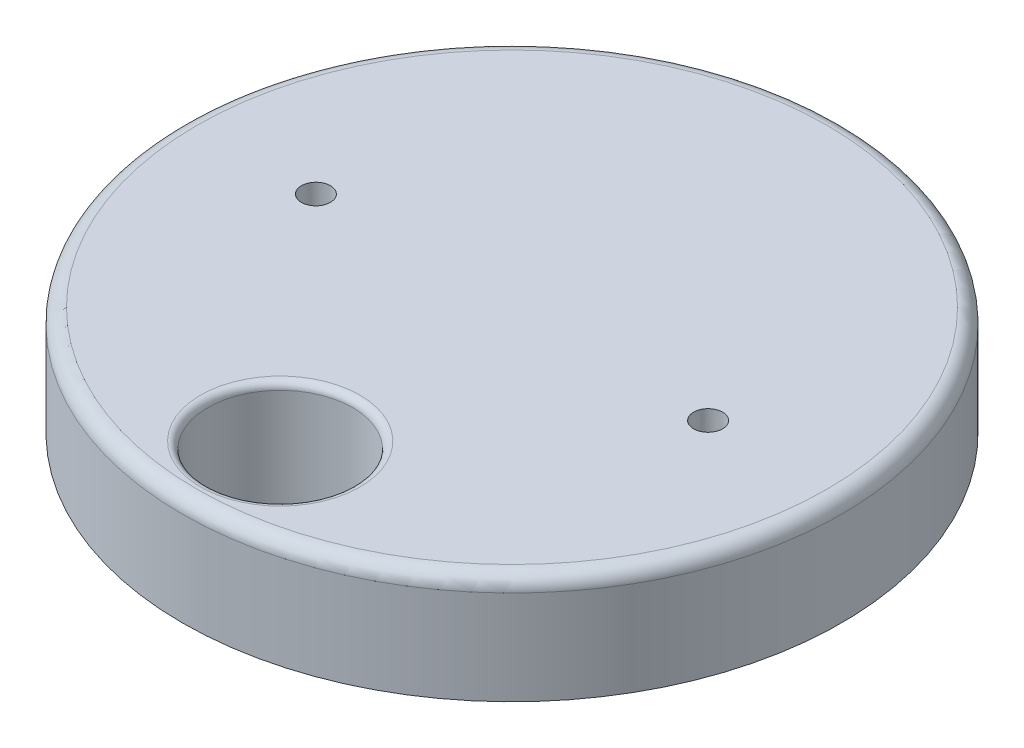
ISO-10303-21;
HEADER;
FILE_DESCRIPTION(('STEP AP214'),'2;1');
FILE_NAME('part.step','',(''),(''),'','','');
FILE_SCHEMA(('AUTOMOTIVE_DESIGN { 1 0 10303 214 1 1 1 1 }'));
ENDSEC;
DATA;
#1=APPLICATION_CONTEXT('core data for automotive mechanical design processes');
#2=APPLICATION_PROTOCOL_DEFINITION('international standard','automotive_design',2000,#1);
#3=PRODUCT_CONTEXT('',#1,'mechanical');
#4=PRODUCT('Part','Part','',(#3));
#5=PRODUCT_RELATED_PRODUCT_CATEGORY('part','',(#4));
#6=PRODUCT_DEFINITION_FORMATION('','',#4);
#7=PRODUCT_DEFINITION_CONTEXT('part definition',#1,'design');
#8=PRODUCT_DEFINITION('design','',#6,#7);
#9=PRODUCT_DEFINITION_SHAPE('','',#8);
#10=(LENGTH_UNIT() NAMED_UNIT(*) SI_UNIT(.MILLI.,.METRE.));
#11=(NAMED_UNIT(*) PLANE_ANGLE_UNIT() SI_UNIT($,.RADIAN.));
#12=(NAMED_UNIT(*) SI_UNIT($,.STERADIAN.) SOLID_ANGLE_UNIT());
#13=UNCERTAINTY_MEASURE_WITH_UNIT(LENGTH_MEASURE(1.E-05),#10,'distance_accuracy_value','');
#14=(GEOMETRIC_REPRESENTATION_CONTEXT(3) GLOBAL_UNCERTAINTY_ASSIGNED_CONTEXT((#13)) GLOBAL_UNIT_ASSIGNED_CONTEXT((#10,
#11,#12)) REPRESENTATION_CONTEXT('',''));
#15=CARTESIAN_POINT('',(0.,0.,0.));
#16=DIRECTION('',(0.,0.,1.));
#17=DIRECTION('',(1.,0.,0.));
#18=AXIS2_PLACEMENT_3D('',#15,#16,#17);
#19=CARTESIAN_POINT('',(27.0743127905892,-40.6568542494924,0.));
#20=DIRECTION('',(0.,1.,0.));
#21=DIRECTION('',(0.,0.,1.));
#22=AXIS2_PLACEMENT_3D('',#19,#20,#21);
#23=CYLINDRICAL_SURFACE('',#22,2.);
#24=CARTESIAN_POINT('',(27.0743127905892,-20.,0.));
#25=DIRECTION('',(0.,-1.,0.));
#26=DIRECTION('',(0.,0.,-1.));
#27=AXIS2_PLACEMENT_3D('',#24,#25,#26);
#28=CIRCLE('',#27,2.);
#29=CARTESIAN_POINT('',(27.0743127905892,-20.,-2.));
#30=VERTEX_POINT('',#29);
#31=EDGE_CURVE('E280',#30,#30,#28,.T.);
#32=ORIENTED_EDGE('',*,*,#31,.F.);
#33=EDGE_LOOP('',(#32));
#34=FACE_BOUND('',#33,.T.);
#35=CARTESIAN_POINT('',(27.0743127905892,-23.,0.));
#36=DIRECTION('',(0.,-1.,0.));
#37=DIRECTION('',(0.,0.,-1.));
#38=AXIS2_PLACEMENT_3D('',#35,#36,#37);
#39=CIRCLE('',#38,2.);
#40=CARTESIAN_POINT('',(27.0743127905892,-23.,-2.));
#41=VERTEX_POINT('',#40);
#42=EDGE_CURVE('E284',#41,#41,#39,.F.);
#43=ORIENTED_EDGE('',*,*,#42,.F.);
#44=EDGE_LOOP('',(#43));
#45=FACE_BOUND('',#44,.T.);
#46=ADVANCED_FACE('F44',(#34,#45),#23,.F.);
#47=CARTESIAN_POINT('',(-27.0743127905892,-40.6568542494924,0.));
#48=DIRECTION('',(0.,1.,0.));
#49=DIRECTION('',(0.,0.,1.));
#50=AXIS2_PLACEMENT_3D('',#47,#48,#49);
#51=CYLINDRICAL_SURFACE('',#50,2.);
#52=CARTESIAN_POINT('',(-27.0743127905892,-20.,0.));
#53=DIRECTION('',(0.,-1.,0.));
#54=DIRECTION('',(0.,0.,-1.));
#55=AXIS2_PLACEMENT_3D('',#52,#53,#54);
#56=CIRCLE('',#55,2.);
#57=CARTESIAN_POINT('',(-27.0743127905892,-20.,-2.));
#58=VERTEX_POINT('',#57);
#59=EDGE_CURVE('E279',#58,#58,#56,.T.);
#60=ORIENTED_EDGE('',*,*,#59,.F.);
#61=EDGE_LOOP('',(#60));
#62=FACE_BOUND('',#61,.T.);
#63=CARTESIAN_POINT('',(-27.0743127905892,-23.,0.));
#64=DIRECTION('',(0.,-1.,0.));
#65=DIRECTION('',(0.,0.,-1.));
#66=AXIS2_PLACEMENT_3D('',#63,#64,#65);
#67=CIRCLE('',#66,2.);
#68=CARTESIAN_POINT('',(-27.0743127905892,-23.,-2.));
#69=VERTEX_POINT('',#68);
#70=EDGE_CURVE('E198',#69,#69,#67,.F.);
#71=ORIENTED_EDGE('',*,*,#70,.F.);
#72=EDGE_LOOP('',(#71));
#73=FACE_BOUND('',#72,.T.);
#74=ADVANCED_FACE('F329',(#62,#73),#51,.F.);
#75=CARTESIAN_POINT('',(0.,-35.,0.));
#76=DIRECTION('',(0.,1.,0.));
#77=DIRECTION('',(0.,0.,1.));
#78=AXIS2_PLACEMENT_3D('',#75,#76,#77);
#79=CYLINDRICAL_SURFACE('',#78,45.5);
#80=CARTESIAN_POINT('',(0.,-22.,0.));
#81=DIRECTION('',(0.,-1.,0.));
#82=DIRECTION('',(0.,0.,-1.));
#83=AXIS2_PLACEMENT_3D('',#80,#81,#82);
#84=CIRCLE('',#83,45.5);
#85=CARTESIAN_POINT('',(0.,-22.,-45.5));
#86=VERTEX_POINT('',#85);
#87=EDGE_CURVE('E53',#86,#86,#84,.T.);
#88=ORIENTED_EDGE('',*,*,#87,.T.);
#89=EDGE_LOOP('',(#88));
#90=FACE_BOUND('',#89,.T.);
#91=CARTESIAN_POINT('',(0.,-35.,0.));
#92=DIRECTION('',(0.,-1.,0.));
#93=DIRECTION('',(0.,0.,-1.));
#94=AXIS2_PLACEMENT_3D('',#91,#92,#93);
#95=CIRCLE('',#94,45.5);
#96=CARTESIAN_POINT('',(0.,-35.,-45.5));
#97=VERTEX_POINT('',#96);
#98=EDGE_CURVE('E274',#97,#97,#95,.T.);
#99=ORIENTED_EDGE('',*,*,#98,.F.);
#100=EDGE_LOOP('',(#99));
#101=FACE_BOUND('',#100,.T.);
#102=ADVANCED_FACE('F304',(#90,#101),#79,.T.);
#103=CARTESIAN_POINT('',(0.,-35.,0.));
#104=DIRECTION('',(0.,-1.,0.));
#105=DIRECTION('',(0.,0.,-1.));
#106=AXIS2_PLACEMENT_3D('',#103,#104,#105);
#107=PLANE('',#106);
#108=CARTESIAN_POINT('',(0.,-35.,32.));
#109=DIRECTION('',(0.,-1.,0.));
#110=DIRECTION('',(0.,0.,-1.));
#111=AXIS2_PLACEMENT_3D('',#108,#109,#110);
#112=CIRCLE('',#111,10.);
#113=CARTESIAN_POINT('',(0.,-35.,22.));
#114=VERTEX_POINT('',#113);
#115=EDGE_CURVE('E166',#114,#114,#112,.F.);
#116=ORIENTED_EDGE('',*,*,#115,.T.);
#117=EDGE_LOOP('',(#116));
#118=FACE_BOUND('',#117,.T.);
#119=DIRECTION('',(-0.866025403784439,0.,0.5));
#120=VECTOR('',#119,1.);
#121=CARTESIAN_POINT('',(-24.0743127905892,-35.,1.73205080756888));
#122=LINE('',#121,#120);
#123=CARTESIAN_POINT('',(-24.0743127905892,-35.,1.73205080756888));
#124=VERTEX_POINT('',#123);
#125=CARTESIAN_POINT('',(-27.0743127905892,-35.,3.46410161513776));
#126=VERTEX_POINT('',#125);
#127=EDGE_CURVE('E60',#124,#126,#122,.T.);
#128=ORIENTED_EDGE('',*,*,#127,.F.);
#129=DIRECTION('',(0.,0.,1.));
#130=VECTOR('',#129,1.);
#131=CARTESIAN_POINT('',(-24.0743127905892,-35.,-1.73205080756888));
#132=LINE('',#131,#130);
#133=CARTESIAN_POINT('',(-24.0743127905892,-35.,-1.73205080756888));
#134=VERTEX_POINT('',#133);
#135=EDGE_CURVE('E159',#134,#124,#132,.T.);
#136=ORIENTED_EDGE('',*,*,#135,.F.);
#137=DIRECTION('',(0.866025403784439,0.,0.5));
#138=VECTOR('',#137,1.);
#139=CARTESIAN_POINT('',(-27.0743127905892,-35.,-3.46410161513776));
#140=LINE('',#139,#138);
#141=CARTESIAN_POINT('',(-27.0743127905892,-35.,-3.46410161513776));
#142=VERTEX_POINT('',#141);
#143=EDGE_CURVE('E163',#142,#134,#140,.T.);
#144=ORIENTED_EDGE('',*,*,#143,.F.);
#145=DIRECTION('',(0.866025403784439,0.,-0.5));
#146=VECTOR('',#145,1.);
#147=CARTESIAN_POINT('',(-30.0743127905892,-35.,-1.73205080756888));
#148=LINE('',#147,#146);
#149=CARTESIAN_POINT('',(-30.0743127905892,-35.,-1.73205080756888));
#150=VERTEX_POINT('',#149);
#151=EDGE_CURVE('E188',#150,#142,#148,.T.);
#152=ORIENTED_EDGE('',*,*,#151,.F.);
#153=DIRECTION('',(0.,0.,-1.));
#154=VECTOR('',#153,1.);
#155=CARTESIAN_POINT('',(-30.0743127905892,-35.,1.73205080756888));
#156=LINE('',#155,#154);
#157=CARTESIAN_POINT('',(-30.0743127905892,-35.,1.73205080756888));
#158=VERTEX_POINT('',#157);
#159=EDGE_CURVE('E184',#158,#150,#156,.T.);
#160=ORIENTED_EDGE('',*,*,#159,.F.);
#161=DIRECTION('',(-0.866025403784439,0.,-0.5));
#162=VECTOR('',#161,1.);
#163=CARTESIAN_POINT('',(-27.0743127905892,-35.,3.46410161513776));
#164=LINE('',#163,#162);
#165=EDGE_CURVE('E181',#126,#158,#164,.T.);
#166=ORIENTED_EDGE('',*,*,#165,.F.);
#167=EDGE_LOOP('',(#128,#136,#144,#152,#160,#166));
#168=FACE_BOUND('',#167,.T.);
#169=DIRECTION('',(-0.866025403784438,0.,0.5));
#170=VECTOR('',#169,1.);
#171=CARTESIAN_POINT('',(30.0743127905892,-35.,1.73205080756888));
#172=LINE('',#171,#170);
#173=CARTESIAN_POINT('',(30.0743127905892,-35.,1.73205080756888));
#174=VERTEX_POINT('',#173);
#175=CARTESIAN_POINT('',(27.0743127905892,-35.,3.46410161513775));
#176=VERTEX_POINT('',#175);
#177=EDGE_CURVE('E68',#174,#176,#172,.T.);
#178=ORIENTED_EDGE('',*,*,#177,.F.);
#179=DIRECTION('',(0.,0.,1.));
#180=VECTOR('',#179,1.);
#181=CARTESIAN_POINT('',(30.0743127905892,-35.,-1.73205080756888));
#182=LINE('',#181,#180);
#183=CARTESIAN_POINT('',(30.0743127905892,-35.,-1.73205080756888));
#184=VERTEX_POINT('',#183);
#185=EDGE_CURVE('E229',#184,#174,#182,.T.);
#186=ORIENTED_EDGE('',*,*,#185,.F.);
#187=DIRECTION('',(0.866025403784439,0.,0.5));
#188=VECTOR('',#187,1.);
#189=CARTESIAN_POINT('',(27.0743127905892,-35.,-3.46410161513775));
#190=LINE('',#189,#188);
#191=CARTESIAN_POINT('',(27.0743127905892,-35.,-3.46410161513775));
#192=VERTEX_POINT('',#191);
#193=EDGE_CURVE('E233',#192,#184,#190,.T.);
#194=ORIENTED_EDGE('',*,*,#193,.F.);
#195=DIRECTION('',(0.866025403784439,0.,-0.499999999999999));
#196=VECTOR('',#195,1.);
#197=CARTESIAN_POINT('',(24.0743127905892,-35.,-1.73205080756888));
#198=LINE('',#197,#196);
#199=CARTESIAN_POINT('',(24.0743127905892,-35.,-1.73205080756888));
#200=VERTEX_POINT('',#199);
#201=EDGE_CURVE('E238',#200,#192,#198,.T.);
#202=ORIENTED_EDGE('',*,*,#201,.F.);
#203=DIRECTION('',(0.,0.,-1.));
#204=VECTOR('',#203,1.);
#205=CARTESIAN_POINT('',(24.0743127905892,-35.,1.73205080756888));
#206=LINE('',#205,#204);
#207=CARTESIAN_POINT('',(24.0743127905892,-35.,1.73205080756888));
#208=VERTEX_POINT('',#207);
#209=EDGE_CURVE('E242',#208,#200,#206,.T.);
#210=ORIENTED_EDGE('',*,*,#209,.F.);
#211=DIRECTION('',(-0.866025403784439,0.,-0.5));
#212=VECTOR('',#211,1.);
#213=CARTESIAN_POINT('',(27.0743127905892,-35.,3.46410161513775));
#214=LINE('',#213,#212);
#215=EDGE_CURVE('E246',#176,#208,#214,.T.);
#216=ORIENTED_EDGE('',*,*,#215,.F.);
#217=EDGE_LOOP('',(#178,#186,#194,#202,#210,#216));
#218=FACE_BOUND('',#217,.T.);
#219=ORIENTED_EDGE('',*,*,#98,.T.);
#220=EDGE_LOOP('',(#219));
#221=FACE_BOUND('',#220,.T.);
#222=ADVANCED_FACE('F353',(#118,#168,#218,#221),#107,.T.);
#223=CARTESIAN_POINT('',(0.,-23.,0.));
#224=DIRECTION('',(0.,-1.,0.));
#225=DIRECTION('',(0.,0.,-1.));
#226=AXIS2_PLACEMENT_3D('',#223,#224,#225);
#227=PLANE('',#226);
#228=DIRECTION('',(-0.866025403784439,0.,0.5));
#229=VECTOR('',#228,1.);
#230=CARTESIAN_POINT('',(-24.0743127905892,-23.,1.73205080756888));
#231=LINE('',#230,#229);
#232=CARTESIAN_POINT('',(-24.0743127905892,-23.,1.73205080756888));
#233=VERTEX_POINT('',#232);
#234=CARTESIAN_POINT('',(-27.0743127905892,-23.,3.46410161513776));
#235=VERTEX_POINT('',#234);
#236=EDGE_CURVE('E136',#233,#235,#231,.T.);
#237=ORIENTED_EDGE('',*,*,#236,.T.);
#238=DIRECTION('',(-0.866025403784439,0.,-0.5));
#239=VECTOR('',#238,1.);
#240=CARTESIAN_POINT('',(-27.0743127905892,-23.,3.46410161513776));
#241=LINE('',#240,#239);
#242=CARTESIAN_POINT('',(-30.0743127905892,-23.,1.73205080756888));
#243=VERTEX_POINT('',#242);
#244=EDGE_CURVE('E146',#235,#243,#241,.T.);
#245=ORIENTED_EDGE('',*,*,#244,.T.);
#246=DIRECTION('',(0.,0.,-1.));
#247=VECTOR('',#246,1.);
#248=CARTESIAN_POINT('',(-30.0743127905892,-23.,1.73205080756888));
#249=LINE('',#248,#247);
#250=CARTESIAN_POINT('',(-30.0743127905892,-23.,-1.73205080756888));
#251=VERTEX_POINT('',#250);
#252=EDGE_CURVE('E152',#243,#251,#249,.T.);
#253=ORIENTED_EDGE('',*,*,#252,.T.);
#254=DIRECTION('',(0.866025403784439,0.,-0.5));
#255=VECTOR('',#254,1.);
#256=CARTESIAN_POINT('',(-30.0743127905892,-23.,-1.73205080756888));
#257=LINE('',#256,#255);
#258=CARTESIAN_POINT('',(-27.0743127905892,-23.,-3.46410161513776));
#259=VERTEX_POINT('',#258);
#260=EDGE_CURVE('E170',#251,#259,#257,.T.);
#261=ORIENTED_EDGE('',*,*,#260,.T.);
#262=DIRECTION('',(0.866025403784439,0.,0.5));
#263=VECTOR('',#262,1.);
#264=CARTESIAN_POINT('',(-27.0743127905892,-23.,-3.46410161513776));
#265=LINE('',#264,#263);
#266=CARTESIAN_POINT('',(-24.0743127905892,-23.,-1.73205080756888));
#267=VERTEX_POINT('',#266);
#268=EDGE_CURVE('E174',#259,#267,#265,.T.);
#269=ORIENTED_EDGE('',*,*,#268,.T.);
#270=DIRECTION('',(0.,0.,1.));
#271=VECTOR('',#270,1.);
#272=CARTESIAN_POINT('',(-24.0743127905892,-23.,-1.73205080756888));
#273=LINE('',#272,#271);
#274=EDGE_CURVE('E143',#267,#233,#273,.T.);
#275=ORIENTED_EDGE('',*,*,#274,.T.);
#276=EDGE_LOOP('',(#237,#245,#253,#261,#269,#275));
#277=FACE_BOUND('',#276,.T.);
#278=ORIENTED_EDGE('',*,*,#70,.T.);
#279=EDGE_LOOP('',(#278));
#280=FACE_BOUND('',#279,.T.);
#281=ADVANCED_FACE('F154',(#277,#280),#227,.T.);
#282=CARTESIAN_POINT('',(-24.0743127905892,-23.,1.73205080756888));
#283=DIRECTION('',(0.5,0.,0.866025403784439));
#284=DIRECTION('',(0.866025403784439,0.,-0.5));
#285=AXIS2_PLACEMENT_3D('',#282,#283,#284);
#286=PLANE('',#285);
#287=ORIENTED_EDGE('',*,*,#127,.T.);
#288=DIRECTION('',(0.,-1.,0.));
#289=VECTOR('',#288,1.);
#290=CARTESIAN_POINT('',(-27.0743127905892,-23.,3.46410161513776));
#291=LINE('',#290,#289);
#292=EDGE_CURVE('E132',#235,#126,#291,.T.);
#293=ORIENTED_EDGE('',*,*,#292,.F.);
#294=ORIENTED_EDGE('',*,*,#236,.F.);
#295=DIRECTION('',(0.,-1.,0.));
#296=VECTOR('',#295,1.);
#297=CARTESIAN_POINT('',(-24.0743127905892,-23.,1.73205080756888));
#298=LINE('',#297,#296);
#299=EDGE_CURVE('E195',#233,#124,#298,.T.);
#300=ORIENTED_EDGE('',*,*,#299,.T.);
#301=EDGE_LOOP('',(#287,#293,#294,#300));
#302=FACE_BOUND('',#301,.T.);
#303=ADVANCED_FACE('F134',(#302),#286,.F.);
#304=CARTESIAN_POINT('',(-24.0743127905892,-23.,-1.73205080756888));
#305=DIRECTION('',(1.,0.,0.));
#306=DIRECTION('',(0.,0.,-1.));
#307=AXIS2_PLACEMENT_3D('',#304,#305,#306);
#308=PLANE('',#307);
#309=ORIENTED_EDGE('',*,*,#135,.T.);
#310=ORIENTED_EDGE('',*,*,#299,.F.);
#311=ORIENTED_EDGE('',*,*,#274,.F.);
#312=DIRECTION('',(0.,-1.,0.));
#313=VECTOR('',#312,1.);
#314=CARTESIAN_POINT('',(-24.0743127905892,-23.,-1.73205080756888));
#315=LINE('',#314,#313);
#316=EDGE_CURVE('E199',#267,#134,#315,.T.);
#317=ORIENTED_EDGE('',*,*,#316,.T.);
#318=EDGE_LOOP('',(#309,#310,#311,#317));
#319=FACE_BOUND('',#318,.T.);
#320=ADVANCED_FACE('F385',(#319),#308,.F.);
#321=CARTESIAN_POINT('',(-27.0743127905892,-23.,-3.46410161513776));
#322=DIRECTION('',(0.5,0.,-0.866025403784439));
#323=DIRECTION('',(-0.866025403784439,0.,-0.5));
#324=AXIS2_PLACEMENT_3D('',#321,#322,#323);
#325=PLANE('',#324);
#326=ORIENTED_EDGE('',*,*,#143,.T.);
#327=ORIENTED_EDGE('',*,*,#316,.F.);
#328=ORIENTED_EDGE('',*,*,#268,.F.);
#329=DIRECTION('',(0.,-1.,0.));
#330=VECTOR('',#329,1.);
#331=CARTESIAN_POINT('',(-27.0743127905892,-23.,-3.46410161513776));
#332=LINE('',#331,#330);
#333=EDGE_CURVE('E202',#259,#142,#332,.T.);
#334=ORIENTED_EDGE('',*,*,#333,.T.);
#335=EDGE_LOOP('',(#326,#327,#328,#334));
#336=FACE_BOUND('',#335,.T.);
#337=ADVANCED_FACE('F393',(#336),#325,.F.);
#338=CARTESIAN_POINT('',(-30.0743127905892,-23.,-1.73205080756888));
#339=DIRECTION('',(-0.5,0.,-0.866025403784439));
#340=DIRECTION('',(-0.866025403784439,0.,0.5));
#341=AXIS2_PLACEMENT_3D('',#338,#339,#340);
#342=PLANE('',#341);
#343=ORIENTED_EDGE('',*,*,#151,.T.);
#344=ORIENTED_EDGE('',*,*,#333,.F.);
#345=ORIENTED_EDGE('',*,*,#260,.F.);
#346=DIRECTION('',(0.,-1.,0.));
#347=VECTOR('',#346,1.);
#348=CARTESIAN_POINT('',(-30.0743127905892,-23.,-1.73205080756888));
#349=LINE('',#348,#347);
#350=EDGE_CURVE('E205',#251,#150,#349,.T.);
#351=ORIENTED_EDGE('',*,*,#350,.T.);
#352=EDGE_LOOP('',(#343,#344,#345,#351));
#353=FACE_BOUND('',#352,.T.);
#354=ADVANCED_FACE('F402',(#353),#342,.F.);
#355=CARTESIAN_POINT('',(-30.0743127905892,-23.,1.73205080756888));
#356=DIRECTION('',(-1.,0.,0.));
#357=DIRECTION('',(0.,0.,1.));
#358=AXIS2_PLACEMENT_3D('',#355,#356,#357);
#359=PLANE('',#358);
#360=ORIENTED_EDGE('',*,*,#159,.T.);
#361=ORIENTED_EDGE('',*,*,#350,.F.);
#362=ORIENTED_EDGE('',*,*,#252,.F.);
#363=DIRECTION('',(0.,-1.,0.));
#364=VECTOR('',#363,1.);
#365=CARTESIAN_POINT('',(-30.0743127905892,-23.,1.73205080756888));
#366=LINE('',#365,#364);
#367=EDGE_CURVE('E142',#243,#158,#366,.T.);
#368=ORIENTED_EDGE('',*,*,#367,.T.);
#369=EDGE_LOOP('',(#360,#361,#362,#368));
#370=FACE_BOUND('',#369,.T.);
#371=ADVANCED_FACE('F345',(#370),#359,.F.);
#372=CARTESIAN_POINT('',(-27.0743127905892,-23.,3.46410161513776));
#373=DIRECTION('',(-0.5,0.,0.866025403784439));
#374=DIRECTION('',(0.866025403784439,0.,0.5));
#375=AXIS2_PLACEMENT_3D('',#372,#373,#374);
#376=PLANE('',#375);
#377=ORIENTED_EDGE('',*,*,#165,.T.);
#378=ORIENTED_EDGE('',*,*,#367,.F.);
#379=ORIENTED_EDGE('',*,*,#244,.F.);
#380=ORIENTED_EDGE('',*,*,#292,.T.);
#381=EDGE_LOOP('',(#377,#378,#379,#380));
#382=FACE_BOUND('',#381,.T.);
#383=ADVANCED_FACE('F147',(#382),#376,.F.);
#384=CARTESIAN_POINT('',(0.,-23.,0.));
#385=DIRECTION('',(0.,-1.,0.));
#386=DIRECTION('',(0.,0.,-1.));
#387=AXIS2_PLACEMENT_3D('',#384,#385,#386);
#388=PLANE('',#387);
#389=DIRECTION('',(-0.866025403784438,0.,0.5));
#390=VECTOR('',#389,1.);
#391=CARTESIAN_POINT('',(30.0743127905892,-23.,1.73205080756888));
#392=LINE('',#391,#390);
#393=CARTESIAN_POINT('',(30.0743127905892,-23.,1.73205080756888));
#394=VERTEX_POINT('',#393);
#395=CARTESIAN_POINT('',(27.0743127905892,-23.,3.46410161513775));
#396=VERTEX_POINT('',#395);
#397=EDGE_CURVE('E234',#394,#396,#392,.T.);
#398=ORIENTED_EDGE('',*,*,#397,.T.);
#399=DIRECTION('',(-0.866025403784439,0.,-0.5));
#400=VECTOR('',#399,1.);
#401=CARTESIAN_POINT('',(27.0743127905892,-23.,3.46410161513775));
#402=LINE('',#401,#400);
#403=CARTESIAN_POINT('',(24.0743127905892,-23.,1.73205080756888));
#404=VERTEX_POINT('',#403);
#405=EDGE_CURVE('E267',#396,#404,#402,.T.);
#406=ORIENTED_EDGE('',*,*,#405,.T.);
#407=DIRECTION('',(0.,0.,-1.));
#408=VECTOR('',#407,1.);
#409=CARTESIAN_POINT('',(24.0743127905892,-23.,1.73205080756888));
#410=LINE('',#409,#408);
#411=CARTESIAN_POINT('',(24.0743127905892,-23.,-1.73205080756888));
#412=VERTEX_POINT('',#411);
#413=EDGE_CURVE('E263',#404,#412,#410,.T.);
#414=ORIENTED_EDGE('',*,*,#413,.T.);
#415=DIRECTION('',(0.866025403784439,0.,-0.499999999999999));
#416=VECTOR('',#415,1.);
#417=CARTESIAN_POINT('',(24.0743127905892,-23.,-1.73205080756888));
#418=LINE('',#417,#416);
#419=CARTESIAN_POINT('',(27.0743127905892,-23.,-3.46410161513775));
#420=VERTEX_POINT('',#419);
#421=EDGE_CURVE('E259',#412,#420,#418,.T.);
#422=ORIENTED_EDGE('',*,*,#421,.T.);
#423=DIRECTION('',(0.866025403784439,0.,0.5));
#424=VECTOR('',#423,1.);
#425=CARTESIAN_POINT('',(27.0743127905892,-23.,-3.46410161513775));
#426=LINE('',#425,#424);
#427=CARTESIAN_POINT('',(30.0743127905892,-23.,-1.73205080756888));
#428=VERTEX_POINT('',#427);
#429=EDGE_CURVE('E255',#420,#428,#426,.T.);
#430=ORIENTED_EDGE('',*,*,#429,.T.);
#431=DIRECTION('',(0.,0.,1.));
#432=VECTOR('',#431,1.);
#433=CARTESIAN_POINT('',(30.0743127905892,-23.,-1.73205080756888));
#434=LINE('',#433,#432);
#435=EDGE_CURVE('E213',#428,#394,#434,.T.);
#436=ORIENTED_EDGE('',*,*,#435,.T.);
#437=EDGE_LOOP('',(#398,#406,#414,#422,#430,#436));
#438=FACE_BOUND('',#437,.T.);
#439=ORIENTED_EDGE('',*,*,#42,.T.);
#440=EDGE_LOOP('',(#439));
#441=FACE_BOUND('',#440,.T.);
#442=ADVANCED_FACE('F333',(#438,#441),#388,.T.);
#443=CARTESIAN_POINT('',(30.0743127905892,-23.,1.73205080756888));
#444=DIRECTION('',(0.5,0.,0.866025403784439));
#445=DIRECTION('',(0.866025403784439,0.,-0.5));
#446=AXIS2_PLACEMENT_3D('',#443,#444,#445);
#447=PLANE('',#446);
#448=ORIENTED_EDGE('',*,*,#177,.T.);
#449=DIRECTION('',(0.,-1.,0.));
#450=VECTOR('',#449,1.);
#451=CARTESIAN_POINT('',(27.0743127905892,-23.,3.46410161513775));
#452=LINE('',#451,#450);
#453=EDGE_CURVE('E210',#396,#176,#452,.T.);
#454=ORIENTED_EDGE('',*,*,#453,.F.);
#455=ORIENTED_EDGE('',*,*,#397,.F.);
#456=DIRECTION('',(0.,-1.,0.));
#457=VECTOR('',#456,1.);
#458=CARTESIAN_POINT('',(30.0743127905892,-23.,1.73205080756888));
#459=LINE('',#458,#457);
#460=EDGE_CURVE('E226',#394,#174,#459,.T.);
#461=ORIENTED_EDGE('',*,*,#460,.T.);
#462=EDGE_LOOP('',(#448,#454,#455,#461));
#463=FACE_BOUND('',#462,.T.);
#464=ADVANCED_FACE('F335',(#463),#447,.F.);
#465=CARTESIAN_POINT('',(30.0743127905892,-23.,-1.73205080756888));
#466=DIRECTION('',(1.,0.,0.));
#467=DIRECTION('',(0.,0.,-1.));
#468=AXIS2_PLACEMENT_3D('',#465,#466,#467);
#469=PLANE('',#468);
#470=ORIENTED_EDGE('',*,*,#185,.T.);
#471=ORIENTED_EDGE('',*,*,#460,.F.);
#472=ORIENTED_EDGE('',*,*,#435,.F.);
#473=DIRECTION('',(0.,-1.,0.));
#474=VECTOR('',#473,1.);
#475=CARTESIAN_POINT('',(30.0743127905892,-23.,-1.73205080756888));
#476=LINE('',#475,#474);
#477=EDGE_CURVE('E223',#428,#184,#476,.T.);
#478=ORIENTED_EDGE('',*,*,#477,.T.);
#479=EDGE_LOOP('',(#470,#471,#472,#478));
#480=FACE_BOUND('',#479,.T.);
#481=ADVANCED_FACE('F343',(#480),#469,.F.);
#482=CARTESIAN_POINT('',(27.0743127905892,-23.,-3.46410161513775));
#483=DIRECTION('',(0.5,0.,-0.866025403784439));
#484=DIRECTION('',(-0.866025403784439,0.,-0.5));
#485=AXIS2_PLACEMENT_3D('',#482,#483,#484);
#486=PLANE('',#485);
#487=ORIENTED_EDGE('',*,*,#193,.T.);
#488=ORIENTED_EDGE('',*,*,#477,.F.);
#489=ORIENTED_EDGE('',*,*,#429,.F.);
#490=DIRECTION('',(0.,-1.,0.));
#491=VECTOR('',#490,1.);
#492=CARTESIAN_POINT('',(27.0743127905892,-23.,-3.46410161513775));
#493=LINE('',#492,#491);
#494=EDGE_CURVE('E220',#420,#192,#493,.T.);
#495=ORIENTED_EDGE('',*,*,#494,.T.);
#496=EDGE_LOOP('',(#487,#488,#489,#495));
#497=FACE_BOUND('',#496,.T.);
#498=ADVANCED_FACE('F492',(#497),#486,.F.);
#499=CARTESIAN_POINT('',(24.0743127905892,-23.,-1.73205080756888));
#500=DIRECTION('',(-0.499999999999999,0.,-0.866025403784439));
#501=DIRECTION('',(-0.866025403784439,0.,0.499999999999999));
#502=AXIS2_PLACEMENT_3D('',#499,#500,#501);
#503=PLANE('',#502);
#504=ORIENTED_EDGE('',*,*,#201,.T.);
#505=ORIENTED_EDGE('',*,*,#494,.F.);
#506=ORIENTED_EDGE('',*,*,#421,.F.);
#507=DIRECTION('',(0.,-1.,0.));
#508=VECTOR('',#507,1.);
#509=CARTESIAN_POINT('',(24.0743127905892,-23.,-1.73205080756888));
#510=LINE('',#509,#508);
#511=EDGE_CURVE('E217',#412,#200,#510,.T.);
#512=ORIENTED_EDGE('',*,*,#511,.T.);
#513=EDGE_LOOP('',(#504,#505,#506,#512));
#514=FACE_BOUND('',#513,.T.);
#515=ADVANCED_FACE('F483',(#514),#503,.F.);
#516=CARTESIAN_POINT('',(24.0743127905892,-23.,1.73205080756888));
#517=DIRECTION('',(-1.,0.,0.));
#518=DIRECTION('',(0.,0.,1.));
#519=AXIS2_PLACEMENT_3D('',#516,#517,#518);
#520=PLANE('',#519);
#521=ORIENTED_EDGE('',*,*,#209,.T.);
#522=ORIENTED_EDGE('',*,*,#511,.F.);
#523=ORIENTED_EDGE('',*,*,#413,.F.);
#524=DIRECTION('',(0.,-1.,0.));
#525=VECTOR('',#524,1.);
#526=CARTESIAN_POINT('',(24.0743127905892,-23.,1.73205080756888));
#527=LINE('',#526,#525);
#528=EDGE_CURVE('E214',#404,#208,#527,.T.);
#529=ORIENTED_EDGE('',*,*,#528,.T.);
#530=EDGE_LOOP('',(#521,#522,#523,#529));
#531=FACE_BOUND('',#530,.T.);
#532=ADVANCED_FACE('F474',(#531),#520,.F.);
#533=CARTESIAN_POINT('',(27.0743127905892,-23.,3.46410161513775));
#534=DIRECTION('',(-0.5,0.,0.866025403784439));
#535=DIRECTION('',(0.866025403784439,0.,0.5));
#536=AXIS2_PLACEMENT_3D('',#533,#534,#535);
#537=PLANE('',#536);
#538=ORIENTED_EDGE('',*,*,#215,.T.);
#539=ORIENTED_EDGE('',*,*,#528,.F.);
#540=ORIENTED_EDGE('',*,*,#405,.F.);
#541=ORIENTED_EDGE('',*,*,#453,.T.);
#542=EDGE_LOOP('',(#538,#539,#540,#541));
#543=FACE_BOUND('',#542,.T.);
#544=ADVANCED_FACE('F465',(#543),#537,.F.);
#545=CARTESIAN_POINT('',(0.,-63.2842712474619,32.));
#546=DIRECTION('',(0.,1.,0.));
#547=DIRECTION('',(0.,0.,1.));
#548=AXIS2_PLACEMENT_3D('',#545,#546,#547);
#549=CYLINDRICAL_SURFACE('',#548,10.);
#550=CARTESIAN_POINT('',(0.,-21.,32.));
#551=DIRECTION('',(0.,-1.,0.));
#552=DIRECTION('',(0.,0.,-1.));
#553=AXIS2_PLACEMENT_3D('',#550,#551,#552);
#554=CIRCLE('',#553,10.);
#555=CARTESIAN_POINT('',(0.,-21.,22.));
#556=VERTEX_POINT('',#555);
#557=EDGE_CURVE('E297',#556,#556,#554,.F.);
#558=ORIENTED_EDGE('',*,*,#557,.T.);
#559=EDGE_LOOP('',(#558));
#560=FACE_BOUND('',#559,.T.);
#561=ORIENTED_EDGE('',*,*,#115,.F.);
#562=EDGE_LOOP('',(#561));
#563=FACE_BOUND('',#562,.T.);
#564=ADVANCED_FACE('F317',(#560,#563),#549,.F.);
#565=CARTESIAN_POINT('',(0.,-21.,32.));
#566=DIRECTION('',(0.,-1.,0.));
#567=DIRECTION('',(0.,0.,-1.));
#568=AXIS2_PLACEMENT_3D('',#565,#566,#567);
#569=TOROIDAL_SURFACE('',#568,11.,1.);
#570=ORIENTED_EDGE('',*,*,#557,.F.);
#571=EDGE_LOOP('',(#570));
#572=FACE_BOUND('',#571,.T.);
#573=CARTESIAN_POINT('',(0.,-20.,32.));
#574=DIRECTION('',(0.,-1.,0.));
#575=DIRECTION('',(0.,0.,-1.));
#576=AXIS2_PLACEMENT_3D('',#573,#574,#575);
#577=CIRCLE('',#576,11.);
#578=CARTESIAN_POINT('',(0.,-20.,21.));
#579=VERTEX_POINT('',#578);
#580=EDGE_CURVE('E278',#579,#579,#577,.T.);
#581=ORIENTED_EDGE('',*,*,#580,.F.);
#582=EDGE_LOOP('',(#581));
#583=FACE_BOUND('',#582,.T.);
#584=ADVANCED_FACE('F309',(#572,#583),#569,.T.);
#585=CARTESIAN_POINT('',(0.,-22.,0.));
#586=DIRECTION('',(0.,-1.,0.));
#587=DIRECTION('',(0.,0.,-1.));
#588=AXIS2_PLACEMENT_3D('',#585,#586,#587);
#589=TOROIDAL_SURFACE('',#588,43.5,2.);
#590=CARTESIAN_POINT('',(0.,-20.,0.));
#591=DIRECTION('',(0.,-1.,0.));
#592=DIRECTION('',(0.,0.,-1.));
#593=AXIS2_PLACEMENT_3D('',#590,#591,#592);
#594=CIRCLE('',#593,43.5);
#595=CARTESIAN_POINT('',(0.,-20.,-43.5));
#596=VERTEX_POINT('',#595);
#597=EDGE_CURVE('E11',#596,#596,#594,.F.);
#598=ORIENTED_EDGE('',*,*,#597,.F.);
#599=EDGE_LOOP('',(#598));
#600=FACE_BOUND('',#599,.T.);
#601=ORIENTED_EDGE('',*,*,#87,.F.);
#602=EDGE_LOOP('',(#601));
#603=FACE_BOUND('',#602,.T.);
#604=ADVANCED_FACE('F46',(#600,#603),#589,.T.);
#605=CARTESIAN_POINT('',(-54.25,-20.,51.8841099132337));
#606=DIRECTION('',(0.,-1.,0.));
#607=DIRECTION('',(0.,0.,-1.));
#608=AXIS2_PLACEMENT_3D('',#605,#606,#607);
#609=PLANE('',#608);
#610=ORIENTED_EDGE('',*,*,#597,.T.);
#611=EDGE_LOOP('',(#610));
#612=FACE_BOUND('',#611,.T.);
#613=ORIENTED_EDGE('',*,*,#580,.T.);
#614=EDGE_LOOP('',(#613));
#615=FACE_BOUND('',#614,.T.);
#616=ORIENTED_EDGE('',*,*,#59,.T.);
#617=EDGE_LOOP('',(#616));
#618=FACE_BOUND('',#617,.T.);
#619=ORIENTED_EDGE('',*,*,#31,.T.);
#620=EDGE_LOOP('',(#619));
#621=FACE_BOUND('',#620,.T.);
#622=ADVANCED_FACE('F308',(#612,#615,#618,#621),#609,.F.);
#623=CLOSED_SHELL('',(#46,#74,#102,#222,#281,#303,#320,#337,#354,#371,#383,#442,#464,#481,#498,
#515,#532,#544,#564,#584,#604,#622));
#624=MANIFOLD_SOLID_BREP('B2',#623);
#625=ADVANCED_BREP_SHAPE_REPRESENTATION('',(#18,#624),#14);
#626=SHAPE_DEFINITION_REPRESENTATION(#9,#625);
ENDSEC;
END-ISO-10303-21;
